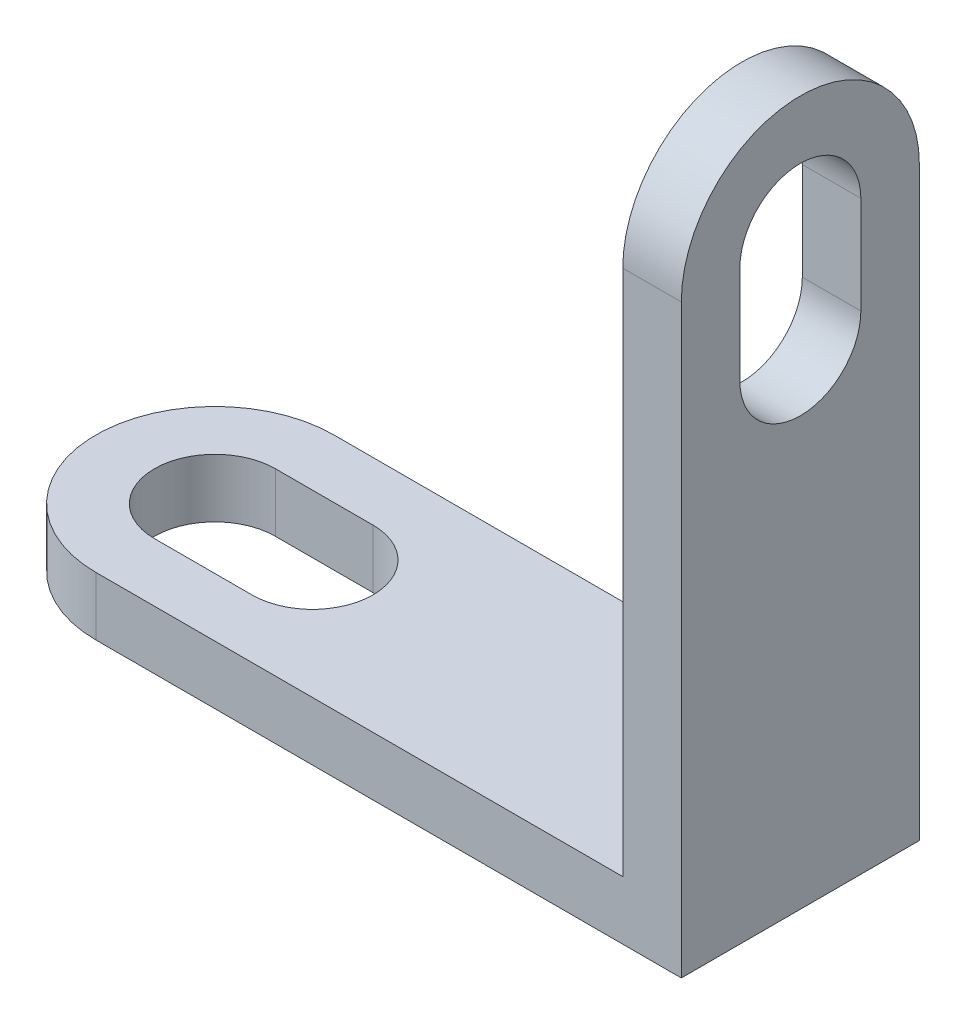
ISO-10303-21;
HEADER;
FILE_DESCRIPTION(('STEP AP214'),'2;1');
FILE_NAME('part.step','',(''),(''),'','','');
FILE_SCHEMA(('AUTOMOTIVE_DESIGN { 1 0 10303 214 1 1 1 1 }'));
ENDSEC;
DATA;
#1=APPLICATION_CONTEXT('core data for automotive mechanical design processes');
#2=APPLICATION_PROTOCOL_DEFINITION('international standard','automotive_design',2000,#1);
#3=PRODUCT_CONTEXT('',#1,'mechanical');
#4=PRODUCT('Part','Part','',(#3));
#5=PRODUCT_RELATED_PRODUCT_CATEGORY('part','',(#4));
#6=PRODUCT_DEFINITION_FORMATION('','',#4);
#7=PRODUCT_DEFINITION_CONTEXT('part definition',#1,'design');
#8=PRODUCT_DEFINITION('design','',#6,#7);
#9=PRODUCT_DEFINITION_SHAPE('','',#8);
#10=(LENGTH_UNIT() NAMED_UNIT(*) SI_UNIT(.MILLI.,.METRE.));
#11=(NAMED_UNIT(*) PLANE_ANGLE_UNIT() SI_UNIT($,.RADIAN.));
#12=(NAMED_UNIT(*) SI_UNIT($,.STERADIAN.) SOLID_ANGLE_UNIT());
#13=UNCERTAINTY_MEASURE_WITH_UNIT(LENGTH_MEASURE(1.E-05),#10,'distance_accuracy_value','');
#14=(GEOMETRIC_REPRESENTATION_CONTEXT(3) GLOBAL_UNCERTAINTY_ASSIGNED_CONTEXT((#13)) GLOBAL_UNIT_ASSIGNED_CONTEXT((#10,
#11,#12)) REPRESENTATION_CONTEXT('',''));
#15=CARTESIAN_POINT('',(0.,0.,0.));
#16=DIRECTION('',(0.,0.,1.));
#17=DIRECTION('',(1.,0.,0.));
#18=AXIS2_PLACEMENT_3D('',#15,#16,#17);
#19=CARTESIAN_POINT('',(-30.,3.,0.));
#20=DIRECTION('',(0.,1.,0.));
#21=DIRECTION('',(0.,0.,1.));
#22=AXIS2_PLACEMENT_3D('',#19,#20,#21);
#23=PLANE('',#22);
#24=DIRECTION('',(1.,0.,0.));
#25=VECTOR('',#24,1.);
#26=CARTESIAN_POINT('',(-30.,3.,3.1));
#27=LINE('',#26,#25);
#28=CARTESIAN_POINT('',(-30.,3.,3.1));
#29=VERTEX_POINT('',#28);
#30=CARTESIAN_POINT('',(-25.,3.,3.1));
#31=VERTEX_POINT('',#30);
#32=EDGE_CURVE('E199',#29,#31,#27,.T.);
#33=ORIENTED_EDGE('',*,*,#32,.F.);
#34=CARTESIAN_POINT('',(-30.,3.,0.));
#35=DIRECTION('',(0.,1.,0.));
#36=DIRECTION('',(0.,0.,1.));
#37=AXIS2_PLACEMENT_3D('',#34,#35,#36);
#38=CIRCLE('',#37,3.1);
#39=CARTESIAN_POINT('',(-30.,3.,-3.1));
#40=VERTEX_POINT('',#39);
#41=EDGE_CURVE('E197',#40,#29,#38,.T.);
#42=ORIENTED_EDGE('',*,*,#41,.F.);
#43=DIRECTION('',(-1.,0.,0.));
#44=VECTOR('',#43,1.);
#45=CARTESIAN_POINT('',(-30.,3.,-3.1));
#46=LINE('',#45,#44);
#47=CARTESIAN_POINT('',(-25.,3.,-3.1));
#48=VERTEX_POINT('',#47);
#49=EDGE_CURVE('E205',#48,#40,#46,.T.);
#50=ORIENTED_EDGE('',*,*,#49,.F.);
#51=CARTESIAN_POINT('',(-25.,3.,0.));
#52=DIRECTION('',(0.,1.,0.));
#53=DIRECTION('',(0.,0.,1.));
#54=AXIS2_PLACEMENT_3D('',#51,#52,#53);
#55=CIRCLE('',#54,3.1);
#56=EDGE_CURVE('E202',#31,#48,#55,.T.);
#57=ORIENTED_EDGE('',*,*,#56,.F.);
#58=EDGE_LOOP('',(#33,#42,#50,#57));
#59=FACE_BOUND('',#58,.T.);
#60=DIRECTION('',(1.,0.,0.));
#61=VECTOR('',#60,1.);
#62=CARTESIAN_POINT('',(0.,3.,6.1));
#63=LINE('',#62,#61);
#64=CARTESIAN_POINT('',(-30.,3.,6.1));
#65=VERTEX_POINT('',#64);
#66=CARTESIAN_POINT('',(-3.,3.,6.1));
#67=VERTEX_POINT('',#66);
#68=EDGE_CURVE('E57',#65,#67,#63,.T.);
#69=ORIENTED_EDGE('',*,*,#68,.T.);
#70=DIRECTION('',(0.,0.,-1.));
#71=VECTOR('',#70,1.);
#72=CARTESIAN_POINT('',(-3.,3.,0.));
#73=LINE('',#72,#71);
#74=CARTESIAN_POINT('',(-3.,3.,-6.1));
#75=VERTEX_POINT('',#74);
#76=EDGE_CURVE('E52',#67,#75,#73,.T.);
#77=ORIENTED_EDGE('',*,*,#76,.T.);
#78=DIRECTION('',(-1.,0.,0.));
#79=VECTOR('',#78,1.);
#80=CARTESIAN_POINT('',(0.,3.,-6.1));
#81=LINE('',#80,#79);
#82=CARTESIAN_POINT('',(-30.,3.,-6.1));
#83=VERTEX_POINT('',#82);
#84=EDGE_CURVE('E228',#75,#83,#81,.T.);
#85=ORIENTED_EDGE('',*,*,#84,.T.);
#86=CARTESIAN_POINT('',(-30.,3.,0.));
#87=DIRECTION('',(0.,1.,0.));
#88=DIRECTION('',(0.,0.,1.));
#89=AXIS2_PLACEMENT_3D('',#86,#87,#88);
#90=CIRCLE('',#89,6.1);
#91=EDGE_CURVE('E230',#83,#65,#90,.T.);
#92=ORIENTED_EDGE('',*,*,#91,.T.);
#93=EDGE_LOOP('',(#69,#77,#85,#92));
#94=FACE_BOUND('',#93,.T.);
#95=ADVANCED_FACE('F37',(#59,#94),#23,.T.);
#96=CARTESIAN_POINT('',(-30.,0.,0.));
#97=DIRECTION('',(0.,1.,0.));
#98=DIRECTION('',(0.,0.,1.));
#99=AXIS2_PLACEMENT_3D('',#96,#97,#98);
#100=PLANE('',#99);
#101=DIRECTION('',(0.,0.,-1.));
#102=VECTOR('',#101,1.);
#103=CARTESIAN_POINT('',(0.,0.,-6.1));
#104=LINE('',#103,#102);
#105=CARTESIAN_POINT('',(0.,0.,6.1));
#106=VERTEX_POINT('',#105);
#107=CARTESIAN_POINT('',(0.,0.,-6.1));
#108=VERTEX_POINT('',#107);
#109=EDGE_CURVE('E227',#106,#108,#104,.T.);
#110=ORIENTED_EDGE('',*,*,#109,.F.);
#111=DIRECTION('',(1.,0.,0.));
#112=VECTOR('',#111,1.);
#113=CARTESIAN_POINT('',(0.,0.,6.1));
#114=LINE('',#113,#112);
#115=CARTESIAN_POINT('',(-30.,0.,6.1));
#116=VERTEX_POINT('',#115);
#117=EDGE_CURVE('E231',#116,#106,#114,.T.);
#118=ORIENTED_EDGE('',*,*,#117,.F.);
#119=CARTESIAN_POINT('',(-30.,0.,0.));
#120=DIRECTION('',(0.,1.,0.));
#121=DIRECTION('',(0.,0.,1.));
#122=AXIS2_PLACEMENT_3D('',#119,#120,#121);
#123=CIRCLE('',#122,6.1);
#124=CARTESIAN_POINT('',(-30.,0.,-6.1));
#125=VERTEX_POINT('',#124);
#126=EDGE_CURVE('E239',#125,#116,#123,.T.);
#127=ORIENTED_EDGE('',*,*,#126,.F.);
#128=DIRECTION('',(-1.,0.,0.));
#129=VECTOR('',#128,1.);
#130=CARTESIAN_POINT('',(0.,0.,-6.1));
#131=LINE('',#130,#129);
#132=EDGE_CURVE('E237',#108,#125,#131,.T.);
#133=ORIENTED_EDGE('',*,*,#132,.F.);
#134=EDGE_LOOP('',(#110,#118,#127,#133));
#135=FACE_BOUND('',#134,.T.);
#136=CARTESIAN_POINT('',(-30.,0.,0.));
#137=DIRECTION('',(0.,1.,0.));
#138=DIRECTION('',(0.,0.,1.));
#139=AXIS2_PLACEMENT_3D('',#136,#137,#138);
#140=CIRCLE('',#139,3.1);
#141=CARTESIAN_POINT('',(-30.,0.,-3.1));
#142=VERTEX_POINT('',#141);
#143=CARTESIAN_POINT('',(-30.,0.,3.1));
#144=VERTEX_POINT('',#143);
#145=EDGE_CURVE('E196',#142,#144,#140,.T.);
#146=ORIENTED_EDGE('',*,*,#145,.T.);
#147=DIRECTION('',(1.,0.,0.));
#148=VECTOR('',#147,1.);
#149=CARTESIAN_POINT('',(-30.,0.,3.1));
#150=LINE('',#149,#148);
#151=CARTESIAN_POINT('',(-25.,0.,3.1));
#152=VERTEX_POINT('',#151);
#153=EDGE_CURVE('E210',#144,#152,#150,.T.);
#154=ORIENTED_EDGE('',*,*,#153,.T.);
#155=CARTESIAN_POINT('',(-25.,0.,0.));
#156=DIRECTION('',(0.,1.,0.));
#157=DIRECTION('',(0.,0.,1.));
#158=AXIS2_PLACEMENT_3D('',#155,#156,#157);
#159=CIRCLE('',#158,3.1);
#160=CARTESIAN_POINT('',(-25.,0.,-3.1));
#161=VERTEX_POINT('',#160);
#162=EDGE_CURVE('E213',#152,#161,#159,.T.);
#163=ORIENTED_EDGE('',*,*,#162,.T.);
#164=DIRECTION('',(-1.,0.,0.));
#165=VECTOR('',#164,1.);
#166=CARTESIAN_POINT('',(-30.,0.,-3.1));
#167=LINE('',#166,#165);
#168=EDGE_CURVE('E200',#161,#142,#167,.T.);
#169=ORIENTED_EDGE('',*,*,#168,.T.);
#170=EDGE_LOOP('',(#146,#154,#163,#169));
#171=FACE_BOUND('',#170,.T.);
#172=ADVANCED_FACE('F257',(#135,#171),#100,.F.);
#173=CARTESIAN_POINT('',(0.,3.,-6.1));
#174=DIRECTION('',(-1.,0.,0.));
#175=DIRECTION('',(0.,0.,1.));
#176=AXIS2_PLACEMENT_3D('',#173,#174,#175);
#177=PLANE('',#176);
#178=ORIENTED_EDGE('',*,*,#109,.T.);
#179=DIRECTION('',(0.,-1.,0.));
#180=VECTOR('',#179,1.);
#181=CARTESIAN_POINT('',(0.,3.,-6.1));
#182=LINE('',#181,#180);
#183=CARTESIAN_POINT('',(0.,30.,-6.1));
#184=VERTEX_POINT('',#183);
#185=EDGE_CURVE('E11',#184,#108,#182,.T.);
#186=ORIENTED_EDGE('',*,*,#185,.F.);
#187=CARTESIAN_POINT('',(0.,30.,0.));
#188=DIRECTION('',(1.,0.,0.));
#189=DIRECTION('',(0.,0.,-1.));
#190=AXIS2_PLACEMENT_3D('',#187,#188,#189);
#191=CIRCLE('',#190,6.1);
#192=CARTESIAN_POINT('',(0.,30.,6.1));
#193=VERTEX_POINT('',#192);
#194=EDGE_CURVE('E175',#184,#193,#191,.T.);
#195=ORIENTED_EDGE('',*,*,#194,.T.);
#196=DIRECTION('',(0.,-1.,0.));
#197=VECTOR('',#196,1.);
#198=CARTESIAN_POINT('',(0.,3.,6.1));
#199=LINE('',#198,#197);
#200=EDGE_CURVE('E234',#193,#106,#199,.T.);
#201=ORIENTED_EDGE('',*,*,#200,.T.);
#202=EDGE_LOOP('',(#178,#186,#195,#201));
#203=FACE_BOUND('',#202,.T.);
#204=CARTESIAN_POINT('',(0.,30.,0.));
#205=DIRECTION('',(1.,0.,0.));
#206=DIRECTION('',(0.,0.,-1.));
#207=AXIS2_PLACEMENT_3D('',#204,#205,#206);
#208=CIRCLE('',#207,3.1);
#209=CARTESIAN_POINT('',(0.,30.,-3.1));
#210=VERTEX_POINT('',#209);
#211=CARTESIAN_POINT('',(0.,30.,3.1));
#212=VERTEX_POINT('',#211);
#213=EDGE_CURVE('E143',#210,#212,#208,.T.);
#214=ORIENTED_EDGE('',*,*,#213,.F.);
#215=DIRECTION('',(0.,1.,0.));
#216=VECTOR('',#215,1.);
#217=CARTESIAN_POINT('',(0.,30.,-3.1));
#218=LINE('',#217,#216);
#219=CARTESIAN_POINT('',(0.,25.,-3.1));
#220=VERTEX_POINT('',#219);
#221=EDGE_CURVE('E160',#220,#210,#218,.T.);
#222=ORIENTED_EDGE('',*,*,#221,.F.);
#223=CARTESIAN_POINT('',(0.,25.,0.));
#224=DIRECTION('',(1.,0.,0.));
#225=DIRECTION('',(0.,0.,-1.));
#226=AXIS2_PLACEMENT_3D('',#223,#224,#225);
#227=CIRCLE('',#226,3.1);
#228=CARTESIAN_POINT('',(0.,25.,3.1));
#229=VERTEX_POINT('',#228);
#230=EDGE_CURVE('E163',#229,#220,#227,.T.);
#231=ORIENTED_EDGE('',*,*,#230,.F.);
#232=DIRECTION('',(0.,-1.,0.));
#233=VECTOR('',#232,1.);
#234=CARTESIAN_POINT('',(0.,30.,3.1));
#235=LINE('',#234,#233);
#236=EDGE_CURVE('E169',#212,#229,#235,.T.);
#237=ORIENTED_EDGE('',*,*,#236,.F.);
#238=EDGE_LOOP('',(#214,#222,#231,#237));
#239=FACE_BOUND('',#238,.T.);
#240=ADVANCED_FACE('F39',(#203,#239),#177,.F.);
#241=CARTESIAN_POINT('',(0.,3.,-6.1));
#242=DIRECTION('',(0.,0.,1.));
#243=DIRECTION('',(1.,0.,0.));
#244=AXIS2_PLACEMENT_3D('',#241,#242,#243);
#245=PLANE('',#244);
#246=ORIENTED_EDGE('',*,*,#132,.T.);
#247=DIRECTION('',(0.,-1.,0.));
#248=VECTOR('',#247,1.);
#249=CARTESIAN_POINT('',(-30.,3.,-6.1));
#250=LINE('',#249,#248);
#251=EDGE_CURVE('E45',#83,#125,#250,.T.);
#252=ORIENTED_EDGE('',*,*,#251,.F.);
#253=ORIENTED_EDGE('',*,*,#84,.F.);
#254=DIRECTION('',(0.,1.,0.));
#255=VECTOR('',#254,1.);
#256=CARTESIAN_POINT('',(-3.,0.,-6.1));
#257=LINE('',#256,#255);
#258=CARTESIAN_POINT('',(-3.,30.,-6.1));
#259=VERTEX_POINT('',#258);
#260=EDGE_CURVE('E179',#75,#259,#257,.T.);
#261=ORIENTED_EDGE('',*,*,#260,.T.);
#262=DIRECTION('',(1.,0.,0.));
#263=VECTOR('',#262,1.);
#264=CARTESIAN_POINT('',(-3.,30.,-6.1));
#265=LINE('',#264,#263);
#266=EDGE_CURVE('E187',#259,#184,#265,.T.);
#267=ORIENTED_EDGE('',*,*,#266,.T.);
#268=ORIENTED_EDGE('',*,*,#185,.T.);
#269=EDGE_LOOP('',(#246,#252,#253,#261,#267,#268));
#270=FACE_BOUND('',#269,.T.);
#271=ADVANCED_FACE('F271',(#270),#245,.F.);
#272=CARTESIAN_POINT('',(-30.,3.,0.));
#273=DIRECTION('',(0.,-1.,0.));
#274=DIRECTION('',(0.,0.,-1.));
#275=AXIS2_PLACEMENT_3D('',#272,#273,#274);
#276=CYLINDRICAL_SURFACE('',#275,6.1);
#277=ORIENTED_EDGE('',*,*,#126,.T.);
#278=DIRECTION('',(0.,-1.,0.));
#279=VECTOR('',#278,1.);
#280=CARTESIAN_POINT('',(-30.,3.,6.1));
#281=LINE('',#280,#279);
#282=EDGE_CURVE('E244',#65,#116,#281,.T.);
#283=ORIENTED_EDGE('',*,*,#282,.F.);
#284=ORIENTED_EDGE('',*,*,#91,.F.);
#285=ORIENTED_EDGE('',*,*,#251,.T.);
#286=EDGE_LOOP('',(#277,#283,#284,#285));
#287=FACE_BOUND('',#286,.T.);
#288=ADVANCED_FACE('F251',(#287),#276,.T.);
#289=CARTESIAN_POINT('',(0.,3.,6.1));
#290=DIRECTION('',(0.,0.,-1.));
#291=DIRECTION('',(-1.,0.,0.));
#292=AXIS2_PLACEMENT_3D('',#289,#290,#291);
#293=PLANE('',#292);
#294=ORIENTED_EDGE('',*,*,#200,.F.);
#295=DIRECTION('',(1.,0.,0.));
#296=VECTOR('',#295,1.);
#297=CARTESIAN_POINT('',(-3.,30.,6.1));
#298=LINE('',#297,#296);
#299=CARTESIAN_POINT('',(-3.,30.,6.1));
#300=VERTEX_POINT('',#299);
#301=EDGE_CURVE('E190',#300,#193,#298,.T.);
#302=ORIENTED_EDGE('',*,*,#301,.F.);
#303=DIRECTION('',(0.,-1.,0.));
#304=VECTOR('',#303,1.);
#305=CARTESIAN_POINT('',(-3.,0.,6.1));
#306=LINE('',#305,#304);
#307=EDGE_CURVE('E184',#300,#67,#306,.T.);
#308=ORIENTED_EDGE('',*,*,#307,.T.);
#309=ORIENTED_EDGE('',*,*,#68,.F.);
#310=ORIENTED_EDGE('',*,*,#282,.T.);
#311=ORIENTED_EDGE('',*,*,#117,.T.);
#312=EDGE_LOOP('',(#294,#302,#308,#309,#310,#311));
#313=FACE_BOUND('',#312,.T.);
#314=ADVANCED_FACE('F260',(#313),#293,.F.);
#315=CARTESIAN_POINT('',(-30.,3.,0.));
#316=DIRECTION('',(0.,-1.,0.));
#317=DIRECTION('',(0.,0.,-1.));
#318=AXIS2_PLACEMENT_3D('',#315,#316,#317);
#319=CYLINDRICAL_SURFACE('',#318,3.1);
#320=ORIENTED_EDGE('',*,*,#145,.F.);
#321=DIRECTION('',(0.,-1.,0.));
#322=VECTOR('',#321,1.);
#323=CARTESIAN_POINT('',(-30.,3.,-3.1));
#324=LINE('',#323,#322);
#325=EDGE_CURVE('E207',#40,#142,#324,.T.);
#326=ORIENTED_EDGE('',*,*,#325,.F.);
#327=ORIENTED_EDGE('',*,*,#41,.T.);
#328=DIRECTION('',(0.,-1.,0.));
#329=VECTOR('',#328,1.);
#330=CARTESIAN_POINT('',(-30.,3.,3.1));
#331=LINE('',#330,#329);
#332=EDGE_CURVE('E224',#29,#144,#331,.T.);
#333=ORIENTED_EDGE('',*,*,#332,.T.);
#334=EDGE_LOOP('',(#320,#326,#327,#333));
#335=FACE_BOUND('',#334,.T.);
#336=ADVANCED_FACE('F281',(#335),#319,.F.);
#337=CARTESIAN_POINT('',(-30.,3.,3.1));
#338=DIRECTION('',(0.,0.,-1.));
#339=DIRECTION('',(-1.,0.,0.));
#340=AXIS2_PLACEMENT_3D('',#337,#338,#339);
#341=PLANE('',#340);
#342=ORIENTED_EDGE('',*,*,#153,.F.);
#343=ORIENTED_EDGE('',*,*,#332,.F.);
#344=ORIENTED_EDGE('',*,*,#32,.T.);
#345=DIRECTION('',(0.,-1.,0.));
#346=VECTOR('',#345,1.);
#347=CARTESIAN_POINT('',(-25.,3.,3.1));
#348=LINE('',#347,#346);
#349=EDGE_CURVE('E222',#31,#152,#348,.T.);
#350=ORIENTED_EDGE('',*,*,#349,.T.);
#351=EDGE_LOOP('',(#342,#343,#344,#350));
#352=FACE_BOUND('',#351,.T.);
#353=ADVANCED_FACE('F326',(#352),#341,.T.);
#354=CARTESIAN_POINT('',(-25.,3.,0.));
#355=DIRECTION('',(0.,-1.,0.));
#356=DIRECTION('',(0.,0.,-1.));
#357=AXIS2_PLACEMENT_3D('',#354,#355,#356);
#358=CYLINDRICAL_SURFACE('',#357,3.1);
#359=ORIENTED_EDGE('',*,*,#162,.F.);
#360=ORIENTED_EDGE('',*,*,#349,.F.);
#361=ORIENTED_EDGE('',*,*,#56,.T.);
#362=DIRECTION('',(0.,-1.,0.));
#363=VECTOR('',#362,1.);
#364=CARTESIAN_POINT('',(-25.,3.,-3.1));
#365=LINE('',#364,#363);
#366=EDGE_CURVE('E220',#48,#161,#365,.T.);
#367=ORIENTED_EDGE('',*,*,#366,.T.);
#368=EDGE_LOOP('',(#359,#360,#361,#367));
#369=FACE_BOUND('',#368,.T.);
#370=ADVANCED_FACE('F315',(#369),#358,.F.);
#371=CARTESIAN_POINT('',(-30.,3.,-3.1));
#372=DIRECTION('',(0.,0.,1.));
#373=DIRECTION('',(1.,0.,0.));
#374=AXIS2_PLACEMENT_3D('',#371,#372,#373);
#375=PLANE('',#374);
#376=ORIENTED_EDGE('',*,*,#168,.F.);
#377=ORIENTED_EDGE('',*,*,#366,.F.);
#378=ORIENTED_EDGE('',*,*,#49,.T.);
#379=ORIENTED_EDGE('',*,*,#325,.T.);
#380=EDGE_LOOP('',(#376,#377,#378,#379));
#381=FACE_BOUND('',#380,.T.);
#382=ADVANCED_FACE('F310',(#381),#375,.T.);
#383=CARTESIAN_POINT('',(-3.,30.,0.));
#384=DIRECTION('',(1.,0.,0.));
#385=DIRECTION('',(0.,0.,-1.));
#386=AXIS2_PLACEMENT_3D('',#383,#384,#385);
#387=CYLINDRICAL_SURFACE('',#386,6.1);
#388=ORIENTED_EDGE('',*,*,#194,.F.);
#389=ORIENTED_EDGE('',*,*,#266,.F.);
#390=CARTESIAN_POINT('',(-3.,30.,0.));
#391=DIRECTION('',(1.,0.,0.));
#392=DIRECTION('',(0.,0.,-1.));
#393=AXIS2_PLACEMENT_3D('',#390,#391,#392);
#394=CIRCLE('',#393,6.1);
#395=EDGE_CURVE('E181',#259,#300,#394,.T.);
#396=ORIENTED_EDGE('',*,*,#395,.T.);
#397=ORIENTED_EDGE('',*,*,#301,.T.);
#398=EDGE_LOOP('',(#388,#389,#396,#397));
#399=FACE_BOUND('',#398,.T.);
#400=ADVANCED_FACE('F266',(#399),#387,.T.);
#401=CARTESIAN_POINT('',(-3.,30.,0.));
#402=DIRECTION('',(1.,0.,0.));
#403=DIRECTION('',(0.,0.,-1.));
#404=AXIS2_PLACEMENT_3D('',#401,#402,#403);
#405=PLANE('',#404);
#406=ORIENTED_EDGE('',*,*,#76,.F.);
#407=ORIENTED_EDGE('',*,*,#307,.F.);
#408=ORIENTED_EDGE('',*,*,#395,.F.);
#409=ORIENTED_EDGE('',*,*,#260,.F.);
#410=EDGE_LOOP('',(#406,#407,#408,#409));
#411=FACE_BOUND('',#410,.T.);
#412=DIRECTION('',(0.,1.,0.));
#413=VECTOR('',#412,1.);
#414=CARTESIAN_POINT('',(-3.,30.,-3.1));
#415=LINE('',#414,#413);
#416=CARTESIAN_POINT('',(-3.,25.,-3.1));
#417=VERTEX_POINT('',#416);
#418=CARTESIAN_POINT('',(-3.,30.,-3.1));
#419=VERTEX_POINT('',#418);
#420=EDGE_CURVE('E148',#417,#419,#415,.T.);
#421=ORIENTED_EDGE('',*,*,#420,.T.);
#422=CARTESIAN_POINT('',(-3.,30.,0.));
#423=DIRECTION('',(1.,0.,0.));
#424=DIRECTION('',(0.,0.,-1.));
#425=AXIS2_PLACEMENT_3D('',#422,#423,#424);
#426=CIRCLE('',#425,3.1);
#427=CARTESIAN_POINT('',(-3.,30.,3.1));
#428=VERTEX_POINT('',#427);
#429=EDGE_CURVE('E140',#419,#428,#426,.T.);
#430=ORIENTED_EDGE('',*,*,#429,.T.);
#431=DIRECTION('',(0.,-1.,0.));
#432=VECTOR('',#431,1.);
#433=CARTESIAN_POINT('',(-3.,30.,3.1));
#434=LINE('',#433,#432);
#435=CARTESIAN_POINT('',(-3.,25.,3.1));
#436=VERTEX_POINT('',#435);
#437=EDGE_CURVE('E152',#428,#436,#434,.T.);
#438=ORIENTED_EDGE('',*,*,#437,.T.);
#439=CARTESIAN_POINT('',(-3.,25.,0.));
#440=DIRECTION('',(1.,0.,0.));
#441=DIRECTION('',(0.,0.,-1.));
#442=AXIS2_PLACEMENT_3D('',#439,#440,#441);
#443=CIRCLE('',#442,3.1);
#444=EDGE_CURVE('E156',#436,#417,#443,.T.);
#445=ORIENTED_EDGE('',*,*,#444,.T.);
#446=EDGE_LOOP('',(#421,#430,#438,#445));
#447=FACE_BOUND('',#446,.T.);
#448=ADVANCED_FACE('F158',(#411,#447),#405,.F.);
#449=CARTESIAN_POINT('',(-3.,30.,0.));
#450=DIRECTION('',(1.,0.,0.));
#451=DIRECTION('',(0.,0.,-1.));
#452=AXIS2_PLACEMENT_3D('',#449,#450,#451);
#453=CYLINDRICAL_SURFACE('',#452,3.1);
#454=ORIENTED_EDGE('',*,*,#213,.T.);
#455=DIRECTION('',(1.,0.,0.));
#456=VECTOR('',#455,1.);
#457=CARTESIAN_POINT('',(-3.,30.,3.1));
#458=LINE('',#457,#456);
#459=EDGE_CURVE('E136',#428,#212,#458,.T.);
#460=ORIENTED_EDGE('',*,*,#459,.F.);
#461=ORIENTED_EDGE('',*,*,#429,.F.);
#462=DIRECTION('',(1.,0.,0.));
#463=VECTOR('',#462,1.);
#464=CARTESIAN_POINT('',(-3.,30.,-3.1));
#465=LINE('',#464,#463);
#466=EDGE_CURVE('E173',#419,#210,#465,.T.);
#467=ORIENTED_EDGE('',*,*,#466,.T.);
#468=EDGE_LOOP('',(#454,#460,#461,#467));
#469=FACE_BOUND('',#468,.T.);
#470=ADVANCED_FACE('F138',(#469),#453,.F.);
#471=CARTESIAN_POINT('',(-3.,30.,-3.1));
#472=DIRECTION('',(0.,0.,-1.));
#473=DIRECTION('',(0.,1.,0.));
#474=AXIS2_PLACEMENT_3D('',#471,#472,#473);
#475=PLANE('',#474);
#476=ORIENTED_EDGE('',*,*,#221,.T.);
#477=ORIENTED_EDGE('',*,*,#466,.F.);
#478=ORIENTED_EDGE('',*,*,#420,.F.);
#479=DIRECTION('',(1.,0.,0.));
#480=VECTOR('',#479,1.);
#481=CARTESIAN_POINT('',(-3.,25.,-3.1));
#482=LINE('',#481,#480);
#483=EDGE_CURVE('E176',#417,#220,#482,.T.);
#484=ORIENTED_EDGE('',*,*,#483,.T.);
#485=EDGE_LOOP('',(#476,#477,#478,#484));
#486=FACE_BOUND('',#485,.T.);
#487=ADVANCED_FACE('F388',(#486),#475,.F.);
#488=CARTESIAN_POINT('',(-3.,25.,0.));
#489=DIRECTION('',(1.,0.,0.));
#490=DIRECTION('',(0.,0.,-1.));
#491=AXIS2_PLACEMENT_3D('',#488,#489,#490);
#492=CYLINDRICAL_SURFACE('',#491,3.1);
#493=ORIENTED_EDGE('',*,*,#230,.T.);
#494=ORIENTED_EDGE('',*,*,#483,.F.);
#495=ORIENTED_EDGE('',*,*,#444,.F.);
#496=DIRECTION('',(1.,0.,0.));
#497=VECTOR('',#496,1.);
#498=CARTESIAN_POINT('',(-3.,25.,3.1));
#499=LINE('',#498,#497);
#500=EDGE_CURVE('E147',#436,#229,#499,.T.);
#501=ORIENTED_EDGE('',*,*,#500,.T.);
#502=EDGE_LOOP('',(#493,#494,#495,#501));
#503=FACE_BOUND('',#502,.T.);
#504=ADVANCED_FACE('F398',(#503),#492,.F.);
#505=CARTESIAN_POINT('',(-3.,30.,3.1));
#506=DIRECTION('',(0.,0.,1.));
#507=DIRECTION('',(1.,0.,0.));
#508=AXIS2_PLACEMENT_3D('',#505,#506,#507);
#509=PLANE('',#508);
#510=ORIENTED_EDGE('',*,*,#236,.T.);
#511=ORIENTED_EDGE('',*,*,#500,.F.);
#512=ORIENTED_EDGE('',*,*,#437,.F.);
#513=ORIENTED_EDGE('',*,*,#459,.T.);
#514=EDGE_LOOP('',(#510,#511,#512,#513));
#515=FACE_BOUND('',#514,.T.);
#516=ADVANCED_FACE('F153',(#515),#509,.F.);
#517=CLOSED_SHELL('',(#95,#172,#240,#271,#288,#314,#336,#353,#370,#382,#400,#448,#470,#487,#504,#516));
#518=MANIFOLD_SOLID_BREP('B2',#517);
#519=ADVANCED_BREP_SHAPE_REPRESENTATION('',(#18,#518),#14);
#520=SHAPE_DEFINITION_REPRESENTATION(#9,#519);
ENDSEC;
END-ISO-10303-21;
